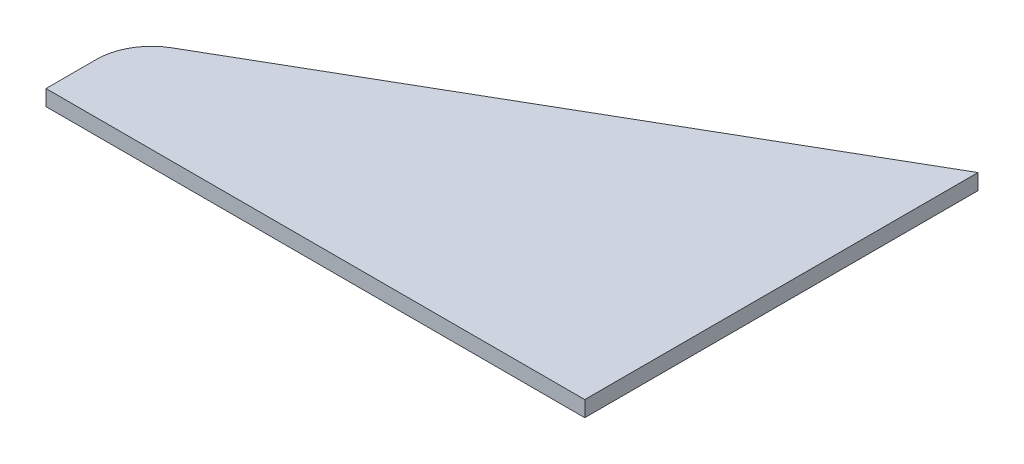
ISO-10303-21;
HEADER;
FILE_DESCRIPTION(('STEP AP214'),'2;1');
FILE_NAME('part.step','',(''),(''),'','','');
FILE_SCHEMA(('AUTOMOTIVE_DESIGN { 1 0 10303 214 1 1 1 1 }'));
ENDSEC;
DATA;
#1=APPLICATION_CONTEXT('core data for automotive mechanical design processes');
#2=APPLICATION_PROTOCOL_DEFINITION('international standard','automotive_design',2000,#1);
#3=PRODUCT_CONTEXT('',#1,'mechanical');
#4=PRODUCT('Part','Part','',(#3));
#5=PRODUCT_RELATED_PRODUCT_CATEGORY('part','',(#4));
#6=PRODUCT_DEFINITION_FORMATION('','',#4);
#7=PRODUCT_DEFINITION_CONTEXT('part definition',#1,'design');
#8=PRODUCT_DEFINITION('design','',#6,#7);
#9=PRODUCT_DEFINITION_SHAPE('','',#8);
#10=(LENGTH_UNIT() NAMED_UNIT(*) SI_UNIT(.MILLI.,.METRE.));
#11=(NAMED_UNIT(*) PLANE_ANGLE_UNIT() SI_UNIT($,.RADIAN.));
#12=(NAMED_UNIT(*) SI_UNIT($,.STERADIAN.) SOLID_ANGLE_UNIT());
#13=UNCERTAINTY_MEASURE_WITH_UNIT(LENGTH_MEASURE(1.E-05),#10,'distance_accuracy_value','');
#14=(GEOMETRIC_REPRESENTATION_CONTEXT(3) GLOBAL_UNCERTAINTY_ASSIGNED_CONTEXT((#13)) GLOBAL_UNIT_ASSIGNED_CONTEXT((#10,
#11,#12)) REPRESENTATION_CONTEXT('',''));
#15=CARTESIAN_POINT('',(0.,0.,0.));
#16=DIRECTION('',(0.,0.,1.));
#17=DIRECTION('',(1.,0.,0.));
#18=AXIS2_PLACEMENT_3D('',#15,#16,#17);
#19=CARTESIAN_POINT('',(-10.4001414253892,6.35,-18.0135733546757));
#20=DIRECTION('',(0.500000000000004,0.,0.866025403784436));
#21=DIRECTION('',(0.866025403784436,0.,-0.500000000000004));
#22=AXIS2_PLACEMENT_3D('',#19,#20,#21);
#23=PLANE('',#22);
#24=DIRECTION('',(-0.866025403784436,0.,0.500000000000004));
#25=VECTOR('',#24,1.);
#26=CARTESIAN_POINT('',(-10.4001414253892,0.,-18.0135733546757));
#27=LINE('',#26,#25);
#28=CARTESIAN_POINT('',(233.3625,0.,-158.75));
#29=VERTEX_POINT('',#28);
#30=CARTESIAN_POINT('',(26.9874999999999,0.,-39.5993381959896));
#31=VERTEX_POINT('',#30);
#32=EDGE_CURVE('E110',#29,#31,#27,.T.);
#33=ORIENTED_EDGE('',*,*,#32,.T.);
#34=DIRECTION('',(0.,-1.,0.));
#35=VECTOR('',#34,1.);
#36=CARTESIAN_POINT('',(26.9874999999999,6.35,-39.5993381959896));
#37=LINE('',#36,#35);
#38=CARTESIAN_POINT('',(26.9874999999999,6.35,-39.5993381959896));
#39=VERTEX_POINT('',#38);
#40=EDGE_CURVE('E11',#39,#31,#37,.T.);
#41=ORIENTED_EDGE('',*,*,#40,.F.);
#42=DIRECTION('',(-0.866025403784436,0.,0.500000000000004));
#43=VECTOR('',#42,1.);
#44=CARTESIAN_POINT('',(-10.4001414253892,6.35,-18.0135733546757));
#45=LINE('',#44,#43);
#46=CARTESIAN_POINT('',(233.3625,6.35,-158.75));
#47=VERTEX_POINT('',#46);
#48=EDGE_CURVE('E118',#47,#39,#45,.T.);
#49=ORIENTED_EDGE('',*,*,#48,.F.);
#50=DIRECTION('',(0.,-1.,0.));
#51=VECTOR('',#50,1.);
#52=CARTESIAN_POINT('',(233.3625,6.35,-158.75));
#53=LINE('',#52,#51);
#54=EDGE_CURVE('E106',#47,#29,#53,.T.);
#55=ORIENTED_EDGE('',*,*,#54,.T.);
#56=EDGE_LOOP('',(#33,#41,#49,#55));
#57=FACE_BOUND('',#56,.T.);
#58=ADVANCED_FACE('F36',(#57),#23,.F.);
#59=CARTESIAN_POINT('',(38.1,6.35,-20.3519235968805));
#60=DIRECTION('',(0.,-1.,0.));
#61=DIRECTION('',(0.,0.,-1.));
#62=AXIS2_PLACEMENT_3D('',#59,#60,#61);
#63=CYLINDRICAL_SURFACE('',#62,22.225);
#64=CARTESIAN_POINT('',(38.1,0.,-20.3519235968805));
#65=DIRECTION('',(0.,1.,0.));
#66=DIRECTION('',(0.,0.,1.));
#67=AXIS2_PLACEMENT_3D('',#64,#65,#66);
#68=CIRCLE('',#67,22.225);
#69=CARTESIAN_POINT('',(15.875,0.,-20.3519235968805));
#70=VERTEX_POINT('',#69);
#71=EDGE_CURVE('E113',#31,#70,#68,.T.);
#72=ORIENTED_EDGE('',*,*,#71,.T.);
#73=DIRECTION('',(0.,-1.,0.));
#74=VECTOR('',#73,1.);
#75=CARTESIAN_POINT('',(15.875,6.35,-20.3519235968805));
#76=LINE('',#75,#74);
#77=CARTESIAN_POINT('',(15.875,6.35,-20.3519235968805));
#78=VERTEX_POINT('',#77);
#79=EDGE_CURVE('E44',#78,#70,#76,.T.);
#80=ORIENTED_EDGE('',*,*,#79,.F.);
#81=CARTESIAN_POINT('',(38.1,6.35,-20.3519235968805));
#82=DIRECTION('',(0.,1.,0.));
#83=DIRECTION('',(0.,0.,1.));
#84=AXIS2_PLACEMENT_3D('',#81,#82,#83);
#85=CIRCLE('',#84,22.225);
#86=EDGE_CURVE('E86',#39,#78,#85,.T.);
#87=ORIENTED_EDGE('',*,*,#86,.F.);
#88=ORIENTED_EDGE('',*,*,#40,.T.);
#89=EDGE_LOOP('',(#72,#80,#87,#88));
#90=FACE_BOUND('',#89,.T.);
#91=ADVANCED_FACE('F137',(#90),#63,.T.);
#92=CARTESIAN_POINT('',(15.875,6.35,0.));
#93=DIRECTION('',(1.,0.,0.));
#94=DIRECTION('',(0.,0.,-1.));
#95=AXIS2_PLACEMENT_3D('',#92,#93,#94);
#96=PLANE('',#95);
#97=DIRECTION('',(0.,0.,1.));
#98=VECTOR('',#97,1.);
#99=CARTESIAN_POINT('',(15.875,0.,0.));
#100=LINE('',#99,#98);
#101=CARTESIAN_POINT('',(15.875,0.,0.));
#102=VERTEX_POINT('',#101);
#103=EDGE_CURVE('E101',#70,#102,#100,.T.);
#104=ORIENTED_EDGE('',*,*,#103,.T.);
#105=DIRECTION('',(0.,-1.,0.));
#106=VECTOR('',#105,1.);
#107=CARTESIAN_POINT('',(15.875,6.35,0.));
#108=LINE('',#107,#106);
#109=CARTESIAN_POINT('',(15.875,6.35,0.));
#110=VERTEX_POINT('',#109);
#111=EDGE_CURVE('E98',#110,#102,#108,.T.);
#112=ORIENTED_EDGE('',*,*,#111,.F.);
#113=DIRECTION('',(0.,0.,1.));
#114=VECTOR('',#113,1.);
#115=CARTESIAN_POINT('',(15.875,6.35,0.));
#116=LINE('',#115,#114);
#117=EDGE_CURVE('E90',#78,#110,#116,.T.);
#118=ORIENTED_EDGE('',*,*,#117,.F.);
#119=ORIENTED_EDGE('',*,*,#79,.T.);
#120=EDGE_LOOP('',(#104,#112,#118,#119));
#121=FACE_BOUND('',#120,.T.);
#122=ADVANCED_FACE('F99',(#121),#96,.F.);
#123=CARTESIAN_POINT('',(0.,6.35,0.));
#124=DIRECTION('',(0.,0.,-1.));
#125=DIRECTION('',(-1.,0.,0.));
#126=AXIS2_PLACEMENT_3D('',#123,#124,#125);
#127=PLANE('',#126);
#128=DIRECTION('',(1.,0.,0.));
#129=VECTOR('',#128,1.);
#130=CARTESIAN_POINT('',(0.,0.,0.));
#131=LINE('',#130,#129);
#132=CARTESIAN_POINT('',(233.3625,0.,0.));
#133=VERTEX_POINT('',#132);
#134=EDGE_CURVE('E72',#102,#133,#131,.T.);
#135=ORIENTED_EDGE('',*,*,#134,.T.);
#136=DIRECTION('',(0.,-1.,0.));
#137=VECTOR('',#136,1.);
#138=CARTESIAN_POINT('',(233.3625,6.35,0.));
#139=LINE('',#138,#137);
#140=CARTESIAN_POINT('',(233.3625,6.35,0.));
#141=VERTEX_POINT('',#140);
#142=EDGE_CURVE('E102',#141,#133,#139,.T.);
#143=ORIENTED_EDGE('',*,*,#142,.F.);
#144=DIRECTION('',(1.,0.,0.));
#145=VECTOR('',#144,1.);
#146=CARTESIAN_POINT('',(0.,6.35,0.));
#147=LINE('',#146,#145);
#148=EDGE_CURVE('E94',#110,#141,#147,.T.);
#149=ORIENTED_EDGE('',*,*,#148,.F.);
#150=ORIENTED_EDGE('',*,*,#111,.T.);
#151=EDGE_LOOP('',(#135,#143,#149,#150));
#152=FACE_BOUND('',#151,.T.);
#153=ADVANCED_FACE('F104',(#152),#127,.F.);
#154=CARTESIAN_POINT('',(233.3625,6.35,0.));
#155=DIRECTION('',(-1.,0.,0.));
#156=DIRECTION('',(0.,0.,1.));
#157=AXIS2_PLACEMENT_3D('',#154,#155,#156);
#158=PLANE('',#157);
#159=DIRECTION('',(0.,0.,-1.));
#160=VECTOR('',#159,1.);
#161=CARTESIAN_POINT('',(233.3625,0.,0.));
#162=LINE('',#161,#160);
#163=EDGE_CURVE('E78',#133,#29,#162,.T.);
#164=ORIENTED_EDGE('',*,*,#163,.T.);
#165=ORIENTED_EDGE('',*,*,#54,.F.);
#166=DIRECTION('',(0.,0.,-1.));
#167=VECTOR('',#166,1.);
#168=CARTESIAN_POINT('',(233.3625,6.35,0.));
#169=LINE('',#168,#167);
#170=EDGE_CURVE('E52',#141,#47,#169,.T.);
#171=ORIENTED_EDGE('',*,*,#170,.F.);
#172=ORIENTED_EDGE('',*,*,#142,.T.);
#173=EDGE_LOOP('',(#164,#165,#171,#172));
#174=FACE_BOUND('',#173,.T.);
#175=ADVANCED_FACE('F126',(#174),#158,.F.);
#176=CARTESIAN_POINT('',(0.,6.35,0.));
#177=DIRECTION('',(0.,1.,0.));
#178=DIRECTION('',(0.,0.,1.));
#179=AXIS2_PLACEMENT_3D('',#176,#177,#178);
#180=PLANE('',#179);
#181=ORIENTED_EDGE('',*,*,#48,.T.);
#182=ORIENTED_EDGE('',*,*,#86,.T.);
#183=ORIENTED_EDGE('',*,*,#117,.T.);
#184=ORIENTED_EDGE('',*,*,#148,.T.);
#185=ORIENTED_EDGE('',*,*,#170,.T.);
#186=EDGE_LOOP('',(#181,#182,#183,#184,#185));
#187=FACE_BOUND('',#186,.T.);
#188=ADVANCED_FACE('F92',(#187),#180,.T.);
#189=CARTESIAN_POINT('',(0.,0.,0.));
#190=DIRECTION('',(0.,1.,0.));
#191=DIRECTION('',(0.,0.,1.));
#192=AXIS2_PLACEMENT_3D('',#189,#190,#191);
#193=PLANE('',#192);
#194=ORIENTED_EDGE('',*,*,#32,.F.);
#195=ORIENTED_EDGE('',*,*,#163,.F.);
#196=ORIENTED_EDGE('',*,*,#134,.F.);
#197=ORIENTED_EDGE('',*,*,#103,.F.);
#198=ORIENTED_EDGE('',*,*,#71,.F.);
#199=EDGE_LOOP('',(#194,#195,#196,#197,#198));
#200=FACE_BOUND('',#199,.T.);
#201=ADVANCED_FACE('F122',(#200),#193,.F.);
#202=CLOSED_SHELL('',(#58,#91,#122,#153,#175,#188,#201));
#203=MANIFOLD_SOLID_BREP('B2',#202);
#204=ADVANCED_BREP_SHAPE_REPRESENTATION('',(#18,#203),#14);
#205=SHAPE_DEFINITION_REPRESENTATION(#9,#204);
ENDSEC;
END-ISO-10303-21;
